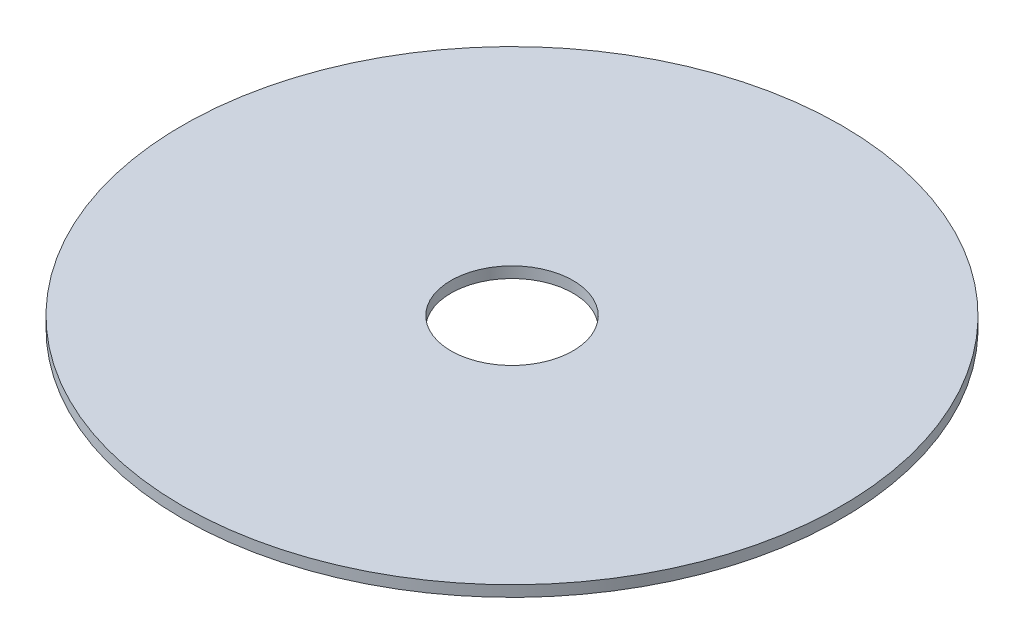
ISO-10303-21;
HEADER;
FILE_DESCRIPTION(('STEP AP214'),'2;1');
FILE_NAME('part.step','',(''),(''),'','','');
FILE_SCHEMA(('AUTOMOTIVE_DESIGN { 1 0 10303 214 1 1 1 1 }'));
ENDSEC;
DATA;
#1=APPLICATION_CONTEXT('core data for automotive mechanical design processes');
#2=APPLICATION_PROTOCOL_DEFINITION('international standard','automotive_design',2000,#1);
#3=PRODUCT_CONTEXT('',#1,'mechanical');
#4=PRODUCT('Part','Part','',(#3));
#5=PRODUCT_RELATED_PRODUCT_CATEGORY('part','',(#4));
#6=PRODUCT_DEFINITION_FORMATION('','',#4);
#7=PRODUCT_DEFINITION_CONTEXT('part definition',#1,'design');
#8=PRODUCT_DEFINITION('design','',#6,#7);
#9=PRODUCT_DEFINITION_SHAPE('','',#8);
#10=(LENGTH_UNIT() NAMED_UNIT(*) SI_UNIT(.MILLI.,.METRE.));
#11=(NAMED_UNIT(*) PLANE_ANGLE_UNIT() SI_UNIT($,.RADIAN.));
#12=(NAMED_UNIT(*) SI_UNIT($,.STERADIAN.) SOLID_ANGLE_UNIT());
#13=UNCERTAINTY_MEASURE_WITH_UNIT(LENGTH_MEASURE(1.E-05),#10,'distance_accuracy_value','');
#14=(GEOMETRIC_REPRESENTATION_CONTEXT(3) GLOBAL_UNCERTAINTY_ASSIGNED_CONTEXT((#13)) GLOBAL_UNIT_ASSIGNED_CONTEXT((#10,
#11,#12)) REPRESENTATION_CONTEXT('',''));
#15=CARTESIAN_POINT('',(0.,0.,0.));
#16=DIRECTION('',(0.,0.,1.));
#17=DIRECTION('',(1.,0.,0.));
#18=AXIS2_PLACEMENT_3D('',#15,#16,#17);
#19=CARTESIAN_POINT('',(0.,2.,0.));
#20=DIRECTION('',(0.,1.,0.));
#21=DIRECTION('',(0.,0.,1.));
#22=AXIS2_PLACEMENT_3D('',#19,#20,#21);
#23=PLANE('',#22);
#24=CARTESIAN_POINT('',(0.,2.,0.));
#25=DIRECTION('',(0.,1.,0.));
#26=DIRECTION('',(0.,0.,1.));
#27=AXIS2_PLACEMENT_3D('',#24,#25,#26);
#28=CIRCLE('',#27,60.);
#29=CARTESIAN_POINT('',(0.,2.,60.));
#30=VERTEX_POINT('',#29);
#31=EDGE_CURVE('E10',#30,#30,#28,.T.);
#32=ORIENTED_EDGE('',*,*,#31,.T.);
#33=EDGE_LOOP('',(#32));
#34=FACE_BOUND('',#33,.T.);
#35=CARTESIAN_POINT('',(0.,2.,0.));
#36=DIRECTION('',(0.,1.,0.));
#37=DIRECTION('',(0.,0.,1.));
#38=AXIS2_PLACEMENT_3D('',#35,#36,#37);
#39=CIRCLE('',#38,11.11);
#40=CARTESIAN_POINT('',(0.,2.,11.11));
#41=VERTEX_POINT('',#40);
#42=EDGE_CURVE('E48',#41,#41,#39,.T.);
#43=ORIENTED_EDGE('',*,*,#42,.F.);
#44=EDGE_LOOP('',(#43));
#45=FACE_BOUND('',#44,.T.);
#46=ADVANCED_FACE('F37',(#34,#45),#23,.T.);
#47=CARTESIAN_POINT('',(0.,0.,0.));
#48=DIRECTION('',(0.,1.,0.));
#49=DIRECTION('',(0.,0.,1.));
#50=AXIS2_PLACEMENT_3D('',#47,#48,#49);
#51=PLANE('',#50);
#52=CARTESIAN_POINT('',(0.,0.,0.));
#53=DIRECTION('',(0.,1.,0.));
#54=DIRECTION('',(0.,0.,1.));
#55=AXIS2_PLACEMENT_3D('',#52,#53,#54);
#56=CIRCLE('',#55,60.);
#57=CARTESIAN_POINT('',(0.,0.,60.));
#58=VERTEX_POINT('',#57);
#59=EDGE_CURVE('E41',#58,#58,#56,.T.);
#60=ORIENTED_EDGE('',*,*,#59,.F.);
#61=EDGE_LOOP('',(#60));
#62=FACE_BOUND('',#61,.T.);
#63=CARTESIAN_POINT('',(0.,0.,0.));
#64=DIRECTION('',(0.,1.,0.));
#65=DIRECTION('',(0.,0.,1.));
#66=AXIS2_PLACEMENT_3D('',#63,#64,#65);
#67=CIRCLE('',#66,11.11);
#68=CARTESIAN_POINT('',(0.,0.,11.11));
#69=VERTEX_POINT('',#68);
#70=EDGE_CURVE('E50',#69,#69,#67,.T.);
#71=ORIENTED_EDGE('',*,*,#70,.T.);
#72=EDGE_LOOP('',(#71));
#73=FACE_BOUND('',#72,.T.);
#74=ADVANCED_FACE('F60',(#62,#73),#51,.F.);
#75=CARTESIAN_POINT('',(0.,2.,0.));
#76=DIRECTION('',(0.,-1.,0.));
#77=DIRECTION('',(0.,0.,-1.));
#78=AXIS2_PLACEMENT_3D('',#75,#76,#77);
#79=CYLINDRICAL_SURFACE('',#78,60.);
#80=ORIENTED_EDGE('',*,*,#31,.F.);
#81=EDGE_LOOP('',(#80));
#82=FACE_BOUND('',#81,.T.);
#83=ORIENTED_EDGE('',*,*,#59,.T.);
#84=EDGE_LOOP('',(#83));
#85=FACE_BOUND('',#84,.T.);
#86=ADVANCED_FACE('F39',(#82,#85),#79,.T.);
#87=CARTESIAN_POINT('',(0.,2.,0.));
#88=DIRECTION('',(0.,-1.,0.));
#89=DIRECTION('',(0.,0.,-1.));
#90=AXIS2_PLACEMENT_3D('',#87,#88,#89);
#91=CYLINDRICAL_SURFACE('',#90,11.11);
#92=ORIENTED_EDGE('',*,*,#42,.T.);
#93=EDGE_LOOP('',(#92));
#94=FACE_BOUND('',#93,.T.);
#95=ORIENTED_EDGE('',*,*,#70,.F.);
#96=EDGE_LOOP('',(#95));
#97=FACE_BOUND('',#96,.T.);
#98=ADVANCED_FACE('F56',(#94,#97),#91,.F.);
#99=CLOSED_SHELL('',(#46,#74,#86,#98));
#100=MANIFOLD_SOLID_BREP('B2',#99);
#101=ADVANCED_BREP_SHAPE_REPRESENTATION('',(#18,#100),#14);
#102=SHAPE_DEFINITION_REPRESENTATION(#9,#101);
ENDSEC;
END-ISO-10303-21;
